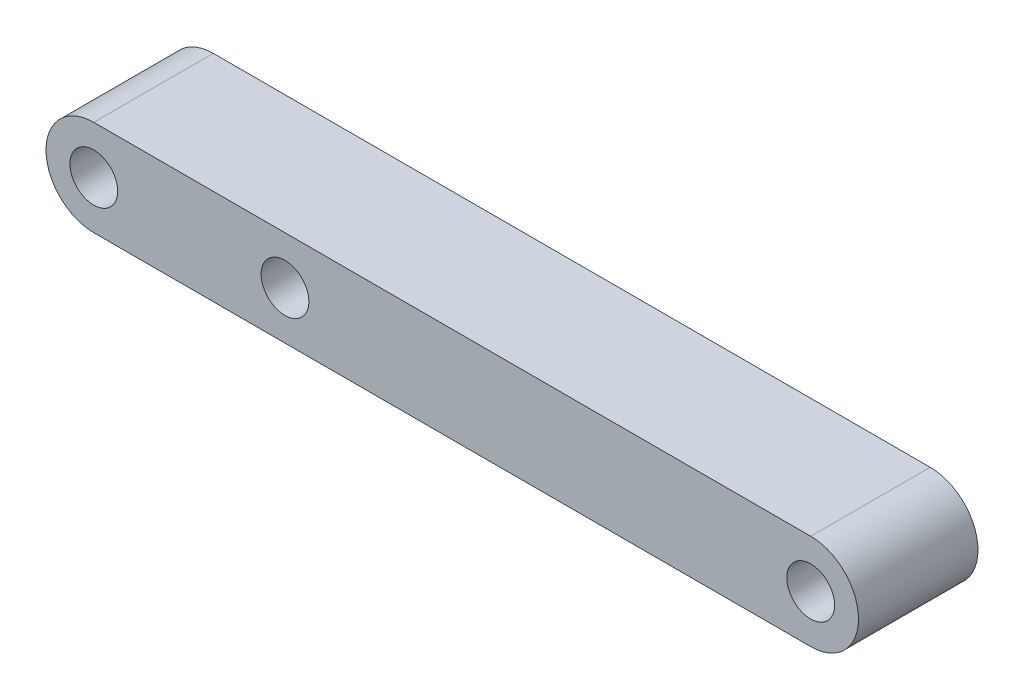
ISO-10303-21;
HEADER;
FILE_DESCRIPTION(('STEP AP214'),'2;1');
FILE_NAME('part.step','',(''),(''),'','','');
FILE_SCHEMA(('AUTOMOTIVE_DESIGN { 1 0 10303 214 1 1 1 1 }'));
ENDSEC;
DATA;
#1=APPLICATION_CONTEXT('core data for automotive mechanical design processes');
#2=APPLICATION_PROTOCOL_DEFINITION('international standard','automotive_design',2000,#1);
#3=PRODUCT_CONTEXT('',#1,'mechanical');
#4=PRODUCT('Part','Part','',(#3));
#5=PRODUCT_RELATED_PRODUCT_CATEGORY('part','',(#4));
#6=PRODUCT_DEFINITION_FORMATION('','',#4);
#7=PRODUCT_DEFINITION_CONTEXT('part definition',#1,'design');
#8=PRODUCT_DEFINITION('design','',#6,#7);
#9=PRODUCT_DEFINITION_SHAPE('','',#8);
#10=(LENGTH_UNIT() NAMED_UNIT(*) SI_UNIT(.MILLI.,.METRE.));
#11=(NAMED_UNIT(*) PLANE_ANGLE_UNIT() SI_UNIT($,.RADIAN.));
#12=(NAMED_UNIT(*) SI_UNIT($,.STERADIAN.) SOLID_ANGLE_UNIT());
#13=UNCERTAINTY_MEASURE_WITH_UNIT(LENGTH_MEASURE(1.E-05),#10,'distance_accuracy_value','');
#14=(GEOMETRIC_REPRESENTATION_CONTEXT(3) GLOBAL_UNCERTAINTY_ASSIGNED_CONTEXT((#13)) GLOBAL_UNIT_ASSIGNED_CONTEXT((#10,
#11,#12)) REPRESENTATION_CONTEXT('',''));
#15=CARTESIAN_POINT('',(0.,0.,0.));
#16=DIRECTION('',(0.,0.,1.));
#17=DIRECTION('',(1.,0.,0.));
#18=AXIS2_PLACEMENT_3D('',#15,#16,#17);
#19=CARTESIAN_POINT('',(0.,0.,10.));
#20=DIRECTION('',(0.,0.,1.));
#21=DIRECTION('',(1.,0.,0.));
#22=AXIS2_PLACEMENT_3D('',#19,#20,#21);
#23=PLANE('',#22);
#24=CARTESIAN_POINT('',(60.,0.,10.));
#25=DIRECTION('',(0.,0.,1.));
#26=DIRECTION('',(1.,0.,0.));
#27=AXIS2_PLACEMENT_3D('',#24,#25,#26);
#28=CIRCLE('',#27,2.);
#29=CARTESIAN_POINT('',(62.,0.,10.));
#30=VERTEX_POINT('',#29);
#31=EDGE_CURVE('E120',#30,#30,#28,.T.);
#32=ORIENTED_EDGE('',*,*,#31,.F.);
#33=EDGE_LOOP('',(#32));
#34=FACE_BOUND('',#33,.T.);
#35=CARTESIAN_POINT('',(0.,0.,10.));
#36=DIRECTION('',(0.,0.,1.));
#37=DIRECTION('',(1.,0.,0.));
#38=AXIS2_PLACEMENT_3D('',#35,#36,#37);
#39=CIRCLE('',#38,4.);
#40=CARTESIAN_POINT('',(0.,4.,10.));
#41=VERTEX_POINT('',#40);
#42=CARTESIAN_POINT('',(0.,-4.,10.));
#43=VERTEX_POINT('',#42);
#44=EDGE_CURVE('E90',#41,#43,#39,.T.);
#45=ORIENTED_EDGE('',*,*,#44,.T.);
#46=DIRECTION('',(1.,0.,0.));
#47=VECTOR('',#46,1.);
#48=CARTESIAN_POINT('',(0.,-4.,10.));
#49=LINE('',#48,#47);
#50=CARTESIAN_POINT('',(60.,-4.,10.));
#51=VERTEX_POINT('',#50);
#52=EDGE_CURVE('E85',#43,#51,#49,.T.);
#53=ORIENTED_EDGE('',*,*,#52,.T.);
#54=CARTESIAN_POINT('',(60.,0.,10.));
#55=DIRECTION('',(0.,0.,1.));
#56=DIRECTION('',(1.,0.,0.));
#57=AXIS2_PLACEMENT_3D('',#54,#55,#56);
#58=CIRCLE('',#57,4.);
#59=CARTESIAN_POINT('',(60.,4.,10.));
#60=VERTEX_POINT('',#59);
#61=EDGE_CURVE('E88',#51,#60,#58,.T.);
#62=ORIENTED_EDGE('',*,*,#61,.T.);
#63=DIRECTION('',(-1.,0.,0.));
#64=VECTOR('',#63,1.);
#65=CARTESIAN_POINT('',(0.,4.,10.));
#66=LINE('',#65,#64);
#67=EDGE_CURVE('E55',#60,#41,#66,.T.);
#68=ORIENTED_EDGE('',*,*,#67,.T.);
#69=EDGE_LOOP('',(#45,#53,#62,#68));
#70=FACE_BOUND('',#69,.T.);
#71=CARTESIAN_POINT('',(0.,0.,10.));
#72=DIRECTION('',(0.,0.,1.));
#73=DIRECTION('',(1.,0.,0.));
#74=AXIS2_PLACEMENT_3D('',#71,#72,#73);
#75=CIRCLE('',#74,2.);
#76=CARTESIAN_POINT('',(2.,0.,10.));
#77=VERTEX_POINT('',#76);
#78=EDGE_CURVE('E105',#77,#77,#75,.T.);
#79=ORIENTED_EDGE('',*,*,#78,.F.);
#80=EDGE_LOOP('',(#79));
#81=FACE_BOUND('',#80,.T.);
#82=CARTESIAN_POINT('',(16.,0.,10.));
#83=DIRECTION('',(0.,0.,1.));
#84=DIRECTION('',(1.,0.,0.));
#85=AXIS2_PLACEMENT_3D('',#82,#83,#84);
#86=CIRCLE('',#85,2.);
#87=CARTESIAN_POINT('',(18.,0.,10.));
#88=VERTEX_POINT('',#87);
#89=EDGE_CURVE('E126',#88,#88,#86,.T.);
#90=ORIENTED_EDGE('',*,*,#89,.F.);
#91=EDGE_LOOP('',(#90));
#92=FACE_BOUND('',#91,.T.);
#93=ADVANCED_FACE('F38',(#34,#70,#81,#92),#23,.T.);
#94=CARTESIAN_POINT('',(0.,0.,0.));
#95=DIRECTION('',(0.,0.,1.));
#96=DIRECTION('',(1.,0.,0.));
#97=AXIS2_PLACEMENT_3D('',#94,#95,#96);
#98=PLANE('',#97);
#99=CARTESIAN_POINT('',(0.,0.,0.));
#100=DIRECTION('',(0.,0.,1.));
#101=DIRECTION('',(1.,0.,0.));
#102=AXIS2_PLACEMENT_3D('',#99,#100,#101);
#103=CIRCLE('',#102,4.);
#104=CARTESIAN_POINT('',(0.,4.,0.));
#105=VERTEX_POINT('',#104);
#106=CARTESIAN_POINT('',(0.,-4.,0.));
#107=VERTEX_POINT('',#106);
#108=EDGE_CURVE('E102',#105,#107,#103,.T.);
#109=ORIENTED_EDGE('',*,*,#108,.F.);
#110=DIRECTION('',(-1.,0.,0.));
#111=VECTOR('',#110,1.);
#112=CARTESIAN_POINT('',(0.,4.,0.));
#113=LINE('',#112,#111);
#114=CARTESIAN_POINT('',(60.,4.,0.));
#115=VERTEX_POINT('',#114);
#116=EDGE_CURVE('E78',#115,#105,#113,.T.);
#117=ORIENTED_EDGE('',*,*,#116,.F.);
#118=CARTESIAN_POINT('',(60.,0.,0.));
#119=DIRECTION('',(0.,0.,1.));
#120=DIRECTION('',(1.,0.,0.));
#121=AXIS2_PLACEMENT_3D('',#118,#119,#120);
#122=CIRCLE('',#121,4.);
#123=CARTESIAN_POINT('',(60.,-4.,0.));
#124=VERTEX_POINT('',#123);
#125=EDGE_CURVE('E72',#124,#115,#122,.T.);
#126=ORIENTED_EDGE('',*,*,#125,.F.);
#127=DIRECTION('',(1.,0.,0.));
#128=VECTOR('',#127,1.);
#129=CARTESIAN_POINT('',(0.,-4.,0.));
#130=LINE('',#129,#128);
#131=EDGE_CURVE('E94',#107,#124,#130,.T.);
#132=ORIENTED_EDGE('',*,*,#131,.F.);
#133=EDGE_LOOP('',(#109,#117,#126,#132));
#134=FACE_BOUND('',#133,.T.);
#135=CARTESIAN_POINT('',(0.,0.,0.));
#136=DIRECTION('',(0.,0.,1.));
#137=DIRECTION('',(1.,0.,0.));
#138=AXIS2_PLACEMENT_3D('',#135,#136,#137);
#139=CIRCLE('',#138,2.);
#140=CARTESIAN_POINT('',(2.,0.,0.));
#141=VERTEX_POINT('',#140);
#142=EDGE_CURVE('E117',#141,#141,#139,.T.);
#143=ORIENTED_EDGE('',*,*,#142,.T.);
#144=EDGE_LOOP('',(#143));
#145=FACE_BOUND('',#144,.T.);
#146=CARTESIAN_POINT('',(60.,0.,0.));
#147=DIRECTION('',(0.,0.,1.));
#148=DIRECTION('',(1.,0.,0.));
#149=AXIS2_PLACEMENT_3D('',#146,#147,#148);
#150=CIRCLE('',#149,2.);
#151=CARTESIAN_POINT('',(62.,0.,0.));
#152=VERTEX_POINT('',#151);
#153=EDGE_CURVE('E123',#152,#152,#150,.T.);
#154=ORIENTED_EDGE('',*,*,#153,.T.);
#155=EDGE_LOOP('',(#154));
#156=FACE_BOUND('',#155,.T.);
#157=CARTESIAN_POINT('',(16.,0.,0.));
#158=DIRECTION('',(0.,0.,1.));
#159=DIRECTION('',(1.,0.,0.));
#160=AXIS2_PLACEMENT_3D('',#157,#158,#159);
#161=CIRCLE('',#160,2.);
#162=CARTESIAN_POINT('',(18.,0.,0.));
#163=VERTEX_POINT('',#162);
#164=EDGE_CURVE('E129',#163,#163,#161,.T.);
#165=ORIENTED_EDGE('',*,*,#164,.T.);
#166=EDGE_LOOP('',(#165));
#167=FACE_BOUND('',#166,.T.);
#168=ADVANCED_FACE('F113',(#134,#145,#156,#167),#98,.F.);
#169=CARTESIAN_POINT('',(0.,0.,10.));
#170=DIRECTION('',(0.,0.,-1.));
#171=DIRECTION('',(-1.,0.,0.));
#172=AXIS2_PLACEMENT_3D('',#169,#170,#171);
#173=CYLINDRICAL_SURFACE('',#172,4.);
#174=ORIENTED_EDGE('',*,*,#108,.T.);
#175=DIRECTION('',(0.,0.,-1.));
#176=VECTOR('',#175,1.);
#177=CARTESIAN_POINT('',(0.,-4.,10.));
#178=LINE('',#177,#176);
#179=EDGE_CURVE('E11',#43,#107,#178,.T.);
#180=ORIENTED_EDGE('',*,*,#179,.F.);
#181=ORIENTED_EDGE('',*,*,#44,.F.);
#182=DIRECTION('',(0.,0.,-1.));
#183=VECTOR('',#182,1.);
#184=CARTESIAN_POINT('',(0.,4.,10.));
#185=LINE('',#184,#183);
#186=EDGE_CURVE('E98',#41,#105,#185,.T.);
#187=ORIENTED_EDGE('',*,*,#186,.T.);
#188=EDGE_LOOP('',(#174,#180,#181,#187));
#189=FACE_BOUND('',#188,.T.);
#190=ADVANCED_FACE('F40',(#189),#173,.T.);
#191=CARTESIAN_POINT('',(0.,-4.,10.));
#192=DIRECTION('',(0.,1.,0.));
#193=DIRECTION('',(0.,0.,1.));
#194=AXIS2_PLACEMENT_3D('',#191,#192,#193);
#195=PLANE('',#194);
#196=ORIENTED_EDGE('',*,*,#131,.T.);
#197=DIRECTION('',(0.,0.,-1.));
#198=VECTOR('',#197,1.);
#199=CARTESIAN_POINT('',(60.,-4.,10.));
#200=LINE('',#199,#198);
#201=EDGE_CURVE('E47',#51,#124,#200,.T.);
#202=ORIENTED_EDGE('',*,*,#201,.F.);
#203=ORIENTED_EDGE('',*,*,#52,.F.);
#204=ORIENTED_EDGE('',*,*,#179,.T.);
#205=EDGE_LOOP('',(#196,#202,#203,#204));
#206=FACE_BOUND('',#205,.T.);
#207=ADVANCED_FACE('F93',(#206),#195,.F.);
#208=CARTESIAN_POINT('',(60.,0.,10.));
#209=DIRECTION('',(0.,0.,-1.));
#210=DIRECTION('',(-1.,0.,0.));
#211=AXIS2_PLACEMENT_3D('',#208,#209,#210);
#212=CYLINDRICAL_SURFACE('',#211,4.);
#213=ORIENTED_EDGE('',*,*,#125,.T.);
#214=DIRECTION('',(0.,0.,-1.));
#215=VECTOR('',#214,1.);
#216=CARTESIAN_POINT('',(60.,4.,10.));
#217=LINE('',#216,#215);
#218=EDGE_CURVE('E95',#60,#115,#217,.T.);
#219=ORIENTED_EDGE('',*,*,#218,.F.);
#220=ORIENTED_EDGE('',*,*,#61,.F.);
#221=ORIENTED_EDGE('',*,*,#201,.T.);
#222=EDGE_LOOP('',(#213,#219,#220,#221));
#223=FACE_BOUND('',#222,.T.);
#224=ADVANCED_FACE('F96',(#223),#212,.T.);
#225=CARTESIAN_POINT('',(0.,4.,10.));
#226=DIRECTION('',(0.,-1.,0.));
#227=DIRECTION('',(0.,0.,-1.));
#228=AXIS2_PLACEMENT_3D('',#225,#226,#227);
#229=PLANE('',#228);
#230=ORIENTED_EDGE('',*,*,#116,.T.);
#231=ORIENTED_EDGE('',*,*,#186,.F.);
#232=ORIENTED_EDGE('',*,*,#67,.F.);
#233=ORIENTED_EDGE('',*,*,#218,.T.);
#234=EDGE_LOOP('',(#230,#231,#232,#233));
#235=FACE_BOUND('',#234,.T.);
#236=ADVANCED_FACE('F110',(#235),#229,.F.);
#237=CARTESIAN_POINT('',(0.,0.,10.));
#238=DIRECTION('',(0.,0.,-1.));
#239=DIRECTION('',(-1.,0.,0.));
#240=AXIS2_PLACEMENT_3D('',#237,#238,#239);
#241=CYLINDRICAL_SURFACE('',#240,2.);
#242=ORIENTED_EDGE('',*,*,#78,.T.);
#243=EDGE_LOOP('',(#242));
#244=FACE_BOUND('',#243,.T.);
#245=ORIENTED_EDGE('',*,*,#142,.F.);
#246=EDGE_LOOP('',(#245));
#247=FACE_BOUND('',#246,.T.);
#248=ADVANCED_FACE('F147',(#244,#247),#241,.F.);
#249=CARTESIAN_POINT('',(60.,0.,10.));
#250=DIRECTION('',(0.,0.,-1.));
#251=DIRECTION('',(-1.,0.,0.));
#252=AXIS2_PLACEMENT_3D('',#249,#250,#251);
#253=CYLINDRICAL_SURFACE('',#252,2.);
#254=ORIENTED_EDGE('',*,*,#31,.T.);
#255=EDGE_LOOP('',(#254));
#256=FACE_BOUND('',#255,.T.);
#257=ORIENTED_EDGE('',*,*,#153,.F.);
#258=EDGE_LOOP('',(#257));
#259=FACE_BOUND('',#258,.T.);
#260=ADVANCED_FACE('F201',(#256,#259),#253,.F.);
#261=CARTESIAN_POINT('',(16.,0.,10.));
#262=DIRECTION('',(0.,0.,-1.));
#263=DIRECTION('',(-1.,0.,0.));
#264=AXIS2_PLACEMENT_3D('',#261,#262,#263);
#265=CYLINDRICAL_SURFACE('',#264,2.);
#266=ORIENTED_EDGE('',*,*,#89,.T.);
#267=EDGE_LOOP('',(#266));
#268=FACE_BOUND('',#267,.T.);
#269=ORIENTED_EDGE('',*,*,#164,.F.);
#270=EDGE_LOOP('',(#269));
#271=FACE_BOUND('',#270,.T.);
#272=ADVANCED_FACE('F135',(#268,#271),#265,.F.);
#273=CLOSED_SHELL('',(#93,#168,#190,#207,#224,#236,#248,#260,#272));
#274=MANIFOLD_SOLID_BREP('B2',#273);
#275=ADVANCED_BREP_SHAPE_REPRESENTATION('',(#18,#274),#14);
#276=SHAPE_DEFINITION_REPRESENTATION(#9,#275);
ENDSEC;
END-ISO-10303-21;
